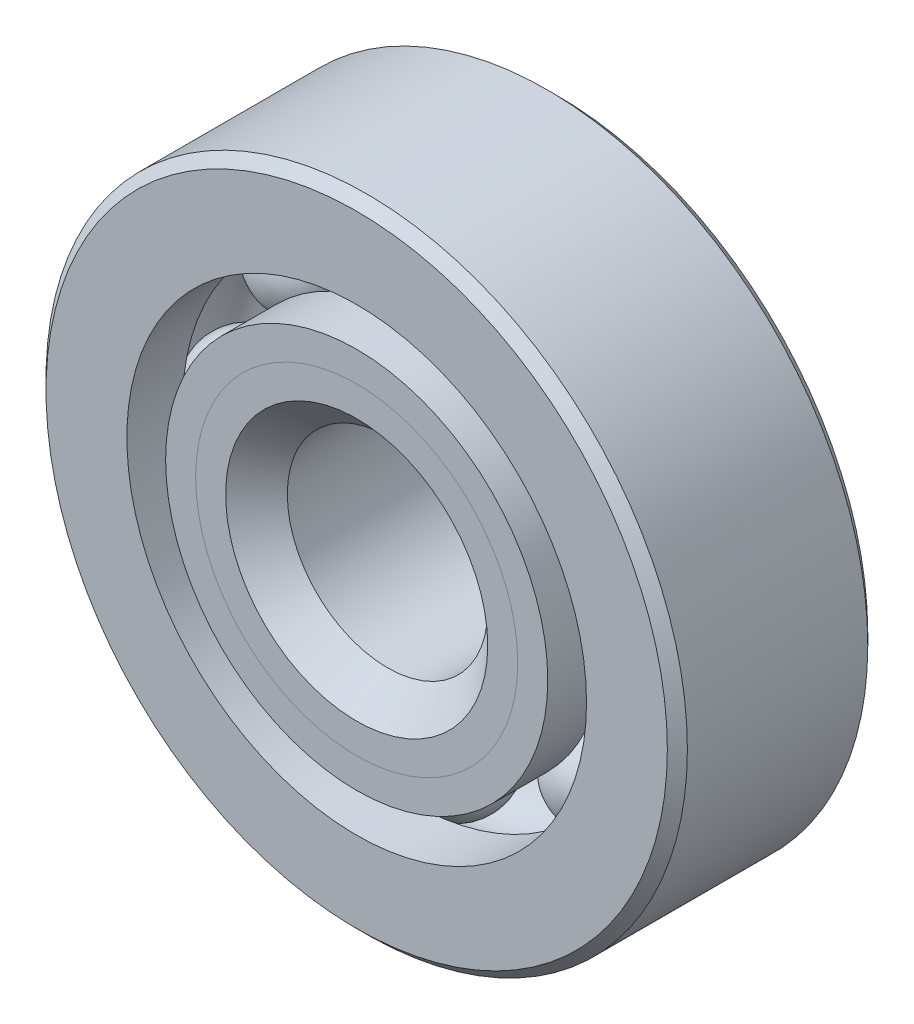
ISO-10303-21;
HEADER;
FILE_DESCRIPTION(('STEP AP214'),'2;1');
FILE_NAME('part.step','',(''),(''),'','','');
FILE_SCHEMA(('AUTOMOTIVE_DESIGN { 1 0 10303 214 1 1 1 1 }'));
ENDSEC;
DATA;
#1=APPLICATION_CONTEXT('core data for automotive mechanical design processes');
#2=APPLICATION_PROTOCOL_DEFINITION('international standard','automotive_design',2000,#1);
#3=PRODUCT_CONTEXT('',#1,'mechanical');
#4=PRODUCT('Part','Part','',(#3));
#5=PRODUCT_RELATED_PRODUCT_CATEGORY('part','',(#4));
#6=PRODUCT_DEFINITION_FORMATION('','',#4);
#7=PRODUCT_DEFINITION_CONTEXT('part definition',#1,'design');
#8=PRODUCT_DEFINITION('design','',#6,#7);
#9=PRODUCT_DEFINITION_SHAPE('','',#8);
#10=(LENGTH_UNIT() NAMED_UNIT(*) SI_UNIT(.MILLI.,.METRE.));
#11=(NAMED_UNIT(*) PLANE_ANGLE_UNIT() SI_UNIT($,.RADIAN.));
#12=(NAMED_UNIT(*) SI_UNIT($,.STERADIAN.) SOLID_ANGLE_UNIT());
#13=UNCERTAINTY_MEASURE_WITH_UNIT(LENGTH_MEASURE(1.E-05),#10,'distance_accuracy_value','');
#14=(GEOMETRIC_REPRESENTATION_CONTEXT(3) GLOBAL_UNCERTAINTY_ASSIGNED_CONTEXT((#13)) GLOBAL_UNIT_ASSIGNED_CONTEXT((#10,
#11,#12)) REPRESENTATION_CONTEXT('',''));
#15=CARTESIAN_POINT('',(0.,0.,0.));
#16=DIRECTION('',(0.,0.,1.));
#17=DIRECTION('',(1.,0.,0.));
#18=AXIS2_PLACEMENT_3D('',#15,#16,#17);
#19=CARTESIAN_POINT('',(-3.71231060122933,3.71231060122942,0.));
#20=DIRECTION('',(0.,0.,1.));
#21=DIRECTION('',(-0.707106781186539,0.707106781186556,0.));
#22=AXIS2_PLACEMENT_3D('',#19,#20,#21);
#23=SPHERICAL_SURFACE('',#22,1.21175743903915);
#24=CARTESIAN_POINT('',(-3.71231060122933,3.71231060122942,1.21175743903915));
#25=VERTEX_POINT('',#24);
#26=VERTEX_LOOP('',#25);
#27=FACE_BOUND('',#26,.T.);
#28=ADVANCED_FACE('F37',(#27),#23,.T.);
#29=CLOSED_SHELL('',(#28));
#30=MANIFOLD_SOLID_BREP('B2',#29);
#31=CARTESIAN_POINT('',(-5.25,0.,0.));
#32=DIRECTION('',(0.,0.,1.));
#33=DIRECTION('',(-1.,0.,0.));
#34=AXIS2_PLACEMENT_3D('',#31,#32,#33);
#35=SPHERICAL_SURFACE('',#34,1.21175743903915);
#36=CARTESIAN_POINT('',(-5.25,0.,1.21175743903915));
#37=VERTEX_POINT('',#36);
#38=VERTEX_LOOP('',#37);
#39=FACE_BOUND('',#38,.T.);
#40=ADVANCED_FACE('F68',(#39),#35,.T.);
#41=CLOSED_SHELL('',(#40));
#42=MANIFOLD_SOLID_BREP('B6',#41);
#43=CARTESIAN_POINT('',(-3.71231060122941,-3.71231060122934,0.));
#44=DIRECTION('',(0.,0.,1.));
#45=DIRECTION('',(-0.707106781186554,-0.707106781186541,0.));
#46=AXIS2_PLACEMENT_3D('',#43,#44,#45);
#47=SPHERICAL_SURFACE('',#46,1.21175743903915);
#48=CARTESIAN_POINT('',(-3.71231060122941,-3.71231060122934,1.21175743903915));
#49=VERTEX_POINT('',#48);
#50=VERTEX_LOOP('',#49);
#51=FACE_BOUND('',#50,.T.);
#52=ADVANCED_FACE('F99',(#51),#47,.T.);
#53=CLOSED_SHELL('',(#52));
#54=MANIFOLD_SOLID_BREP('B33',#53);
#55=CARTESIAN_POINT('',(0.,-5.25,0.));
#56=DIRECTION('',(0.,0.,1.));
#57=DIRECTION('',(0.,-1.,0.));
#58=AXIS2_PLACEMENT_3D('',#55,#56,#57);
#59=SPHERICAL_SURFACE('',#58,1.21175743903915);
#60=CARTESIAN_POINT('',(0.,-5.25,1.21175743903915));
#61=VERTEX_POINT('',#60);
#62=VERTEX_LOOP('',#61);
#63=FACE_BOUND('',#62,.T.);
#64=ADVANCED_FACE('F130',(#63),#59,.T.);
#65=CLOSED_SHELL('',(#64));
#66=MANIFOLD_SOLID_BREP('B64',#65);
#67=CARTESIAN_POINT('',(3.71231060122936,-3.71231060122939,0.));
#68=DIRECTION('',(0.,0.,1.));
#69=DIRECTION('',(0.707106781186544,-0.707106781186551,0.));
#70=AXIS2_PLACEMENT_3D('',#67,#68,#69);
#71=SPHERICAL_SURFACE('',#70,1.21175743903915);
#72=CARTESIAN_POINT('',(3.71231060122936,-3.71231060122939,1.21175743903915));
#73=VERTEX_POINT('',#72);
#74=VERTEX_LOOP('',#73);
#75=FACE_BOUND('',#74,.T.);
#76=ADVANCED_FACE('F161',(#75),#71,.T.);
#77=CLOSED_SHELL('',(#76));
#78=MANIFOLD_SOLID_BREP('B95',#77);
#79=CARTESIAN_POINT('',(5.25,0.,0.));
#80=DIRECTION('',(0.,0.,1.));
#81=DIRECTION('',(1.,0.,0.));
#82=AXIS2_PLACEMENT_3D('',#79,#80,#81);
#83=SPHERICAL_SURFACE('',#82,1.21175743903915);
#84=CARTESIAN_POINT('',(5.25,0.,1.21175743903915));
#85=VERTEX_POINT('',#84);
#86=VERTEX_LOOP('',#85);
#87=FACE_BOUND('',#86,.T.);
#88=ADVANCED_FACE('F192',(#87),#83,.T.);
#89=CLOSED_SHELL('',(#88));
#90=MANIFOLD_SOLID_BREP('B126',#89);
#91=CARTESIAN_POINT('',(3.71231060122938,3.71231060122937,0.));
#92=DIRECTION('',(0.,0.,1.));
#93=DIRECTION('',(0.707106781186549,0.707106781186546,0.));
#94=AXIS2_PLACEMENT_3D('',#91,#92,#93);
#95=SPHERICAL_SURFACE('',#94,1.21175743903915);
#96=CARTESIAN_POINT('',(3.71231060122938,3.71231060122937,1.21175743903915));
#97=VERTEX_POINT('',#96);
#98=VERTEX_LOOP('',#97);
#99=FACE_BOUND('',#98,.T.);
#100=ADVANCED_FACE('F223',(#99),#95,.T.);
#101=CLOSED_SHELL('',(#100));
#102=MANIFOLD_SOLID_BREP('B157',#101);
#103=CARTESIAN_POINT('',(0.,5.25,0.));
#104=DIRECTION('',(0.,0.,1.));
#105=DIRECTION('',(0.,1.,0.));
#106=AXIS2_PLACEMENT_3D('',#103,#104,#105);
#107=SPHERICAL_SURFACE('',#106,1.21175743903915);
#108=CARTESIAN_POINT('',(0.,5.25,1.21175743903915));
#109=VERTEX_POINT('',#108);
#110=VERTEX_LOOP('',#109);
#111=FACE_BOUND('',#110,.T.);
#112=ADVANCED_FACE('F256',(#111),#107,.T.);
#113=CLOSED_SHELL('',(#112));
#114=MANIFOLD_SOLID_BREP('B188',#113);
#115=CARTESIAN_POINT('',(0.,4.01780239848197,2.5));
#116=DIRECTION('',(0.,0.,-1.));
#117=DIRECTION('',(-1.,0.,0.));
#118=AXIS2_PLACEMENT_3D('',#115,#116,#117);
#119=PLANE('',#118);
#120=CARTESIAN_POINT('',(0.,0.,2.5));
#121=DIRECTION('',(0.,0.,1.));
#122=DIRECTION('',(1.,0.,0.));
#123=AXIS2_PLACEMENT_3D('',#120,#121,#122);
#124=CIRCLE('',#123,3.26912128048043);
#125=CARTESIAN_POINT('',(3.26912128048043,0.,2.5));
#126=VERTEX_POINT('',#125);
#127=EDGE_CURVE('E310',#126,#126,#124,.T.);
#128=ORIENTED_EDGE('',*,*,#127,.F.);
#129=EDGE_LOOP('',(#128));
#130=FACE_BOUND('',#129,.T.);
#131=CARTESIAN_POINT('',(0.,0.,2.5));
#132=DIRECTION('',(0.,0.,1.));
#133=DIRECTION('',(1.,0.,0.));
#134=AXIS2_PLACEMENT_3D('',#131,#132,#133);
#135=CIRCLE('',#134,4.01780239848197);
#136=CARTESIAN_POINT('',(4.01780239848197,0.,2.5));
#137=VERTEX_POINT('',#136);
#138=EDGE_CURVE('E255',#137,#137,#135,.T.);
#139=ORIENTED_EDGE('',*,*,#138,.T.);
#140=EDGE_LOOP('',(#139));
#141=FACE_BOUND('',#140,.T.);
#142=ADVANCED_FACE('F276',(#130,#141),#119,.F.);
#143=CARTESIAN_POINT('',(0.,0.,1.75131888199845));
#144=DIRECTION('',(0.,0.,1.));
#145=DIRECTION('',(1.,0.,0.));
#146=AXIS2_PLACEMENT_3D('',#143,#144,#145);
#147=CONICAL_SURFACE('',#146,3.26912128048043,0.78539816339745);
#148=ORIENTED_EDGE('',*,*,#138,.F.);
#149=EDGE_LOOP('',(#148));
#150=FACE_BOUND('',#149,.T.);
#151=CARTESIAN_POINT('',(0.,0.,1.75131888199845));
#152=DIRECTION('',(0.,0.,1.));
#153=DIRECTION('',(1.,0.,0.));
#154=AXIS2_PLACEMENT_3D('',#151,#152,#153);
#155=CIRCLE('',#154,3.26912128048043);
#156=CARTESIAN_POINT('',(3.26912128048043,0.,1.75131888199845));
#157=VERTEX_POINT('',#156);
#158=EDGE_CURVE('E282',#157,#157,#155,.T.);
#159=ORIENTED_EDGE('',*,*,#158,.T.);
#160=EDGE_LOOP('',(#159));
#161=FACE_BOUND('',#160,.T.);
#162=ADVANCED_FACE('F317',(#150,#161),#147,.T.);
#163=CARTESIAN_POINT('',(0.,0.,2.5));
#164=DIRECTION('',(0.,0.,1.));
#165=DIRECTION('',(1.,0.,0.));
#166=AXIS2_PLACEMENT_3D('',#163,#164,#165);
#167=CYLINDRICAL_SURFACE('',#166,3.26912128048043);
#168=ORIENTED_EDGE('',*,*,#158,.F.);
#169=EDGE_LOOP('',(#168));
#170=FACE_BOUND('',#169,.T.);
#171=CARTESIAN_POINT('',(0.,0.,0.));
#172=DIRECTION('',(0.,0.,1.));
#173=DIRECTION('',(1.,0.,0.));
#174=AXIS2_PLACEMENT_3D('',#171,#172,#173);
#175=CIRCLE('',#174,3.26912128048043);
#176=CARTESIAN_POINT('',(3.26912128048043,0.,0.));
#177=VERTEX_POINT('',#176);
#178=EDGE_CURVE('E286',#177,#177,#175,.T.);
#179=ORIENTED_EDGE('',*,*,#178,.T.);
#180=EDGE_LOOP('',(#179));
#181=FACE_BOUND('',#180,.T.);
#182=ADVANCED_FACE('F321',(#170,#181),#167,.T.);
#183=CARTESIAN_POINT('',(0.,3.26912128048043,0.));
#184=DIRECTION('',(0.,0.,-1.));
#185=DIRECTION('',(-1.,0.,0.));
#186=AXIS2_PLACEMENT_3D('',#183,#184,#185);
#187=PLANE('',#186);
#188=ORIENTED_EDGE('',*,*,#178,.F.);
#189=EDGE_LOOP('',(#188));
#190=FACE_BOUND('',#189,.T.);
#191=CARTESIAN_POINT('',(0.,0.,0.));
#192=DIRECTION('',(0.,0.,1.));
#193=DIRECTION('',(1.,0.,0.));
#194=AXIS2_PLACEMENT_3D('',#191,#192,#193);
#195=CIRCLE('',#194,4.03824256096085);
#196=CARTESIAN_POINT('',(4.03824256096085,0.,0.));
#197=VERTEX_POINT('',#196);
#198=EDGE_CURVE('E290',#197,#197,#195,.T.);
#199=ORIENTED_EDGE('',*,*,#198,.T.);
#200=EDGE_LOOP('',(#199));
#201=FACE_BOUND('',#200,.T.);
#202=ADVANCED_FACE('F326',(#190,#201),#187,.F.);
#203=CARTESIAN_POINT('',(0.,0.,0.));
#204=DIRECTION('',(0.,0.,1.));
#205=DIRECTION('',(1.,0.,0.));
#206=AXIS2_PLACEMENT_3D('',#203,#204,#205);
#207=TOROIDAL_SURFACE('',#206,5.25,1.21175743903915);
#208=ORIENTED_EDGE('',*,*,#198,.F.);
#209=EDGE_LOOP('',(#208));
#210=FACE_BOUND('',#209,.T.);
#211=CARTESIAN_POINT('',(0.,0.,-1.11111111111111));
#212=DIRECTION('',(0.,0.,1.));
#213=DIRECTION('',(1.,0.,0.));
#214=AXIS2_PLACEMENT_3D('',#211,#212,#213);
#215=CIRCLE('',#214,4.76648351648352);
#216=CARTESIAN_POINT('',(4.76648351648352,0.,-1.11111111111111));
#217=VERTEX_POINT('',#216);
#218=EDGE_CURVE('E295',#217,#217,#215,.T.);
#219=ORIENTED_EDGE('',*,*,#218,.T.);
#220=EDGE_LOOP('',(#219));
#221=FACE_BOUND('',#220,.T.);
#222=ADVANCED_FACE('F332',(#210,#221),#207,.F.);
#223=CARTESIAN_POINT('',(0.,0.,2.5));
#224=DIRECTION('',(0.,0.,1.));
#225=DIRECTION('',(1.,0.,0.));
#226=AXIS2_PLACEMENT_3D('',#223,#224,#225);
#227=CYLINDRICAL_SURFACE('',#226,4.76648351648352);
#228=ORIENTED_EDGE('',*,*,#218,.F.);
#229=EDGE_LOOP('',(#228));
#230=FACE_BOUND('',#229,.T.);
#231=CARTESIAN_POINT('',(0.,0.,-2.5));
#232=DIRECTION('',(0.,0.,1.));
#233=DIRECTION('',(1.,0.,0.));
#234=AXIS2_PLACEMENT_3D('',#231,#232,#233);
#235=CIRCLE('',#234,4.76648351648352);
#236=CARTESIAN_POINT('',(4.76648351648352,0.,-2.5));
#237=VERTEX_POINT('',#236);
#238=EDGE_CURVE('E298',#237,#237,#235,.T.);
#239=ORIENTED_EDGE('',*,*,#238,.T.);
#240=EDGE_LOOP('',(#239));
#241=FACE_BOUND('',#240,.T.);
#242=ADVANCED_FACE('F336',(#230,#241),#227,.T.);
#243=CARTESIAN_POINT('',(0.,2.75,-2.5));
#244=DIRECTION('',(0.,0.,1.));
#245=DIRECTION('',(1.,0.,0.));
#246=AXIS2_PLACEMENT_3D('',#243,#244,#245);
#247=PLANE('',#246);
#248=ORIENTED_EDGE('',*,*,#238,.F.);
#249=EDGE_LOOP('',(#248));
#250=FACE_BOUND('',#249,.T.);
#251=CARTESIAN_POINT('',(0.,0.,-2.5));
#252=DIRECTION('',(0.,0.,1.));
#253=DIRECTION('',(1.,0.,0.));
#254=AXIS2_PLACEMENT_3D('',#251,#252,#253);
#255=CIRCLE('',#254,2.75);
#256=CARTESIAN_POINT('',(2.75,0.,-2.5));
#257=VERTEX_POINT('',#256);
#258=EDGE_CURVE('E301',#257,#257,#255,.T.);
#259=ORIENTED_EDGE('',*,*,#258,.T.);
#260=EDGE_LOOP('',(#259));
#261=FACE_BOUND('',#260,.T.);
#262=ADVANCED_FACE('F340',(#250,#261),#247,.F.);
#263=CARTESIAN_POINT('',(0.,0.,-2.25));
#264=DIRECTION('',(0.,0.,-1.));
#265=DIRECTION('',(-1.,0.,0.));
#266=AXIS2_PLACEMENT_3D('',#263,#264,#265);
#267=CONICAL_SURFACE('',#266,2.5,0.785398163397447);
#268=ORIENTED_EDGE('',*,*,#258,.F.);
#269=EDGE_LOOP('',(#268));
#270=FACE_BOUND('',#269,.T.);
#271=CARTESIAN_POINT('',(0.,0.,-2.25));
#272=DIRECTION('',(0.,0.,1.));
#273=DIRECTION('',(1.,0.,0.));
#274=AXIS2_PLACEMENT_3D('',#271,#272,#273);
#275=CIRCLE('',#274,2.5);
#276=CARTESIAN_POINT('',(2.5,0.,-2.25));
#277=VERTEX_POINT('',#276);
#278=EDGE_CURVE('E304',#277,#277,#275,.T.);
#279=ORIENTED_EDGE('',*,*,#278,.T.);
#280=EDGE_LOOP('',(#279));
#281=FACE_BOUND('',#280,.T.);
#282=ADVANCED_FACE('F344',(#270,#281),#267,.F.);
#283=CARTESIAN_POINT('',(0.,0.,2.5));
#284=DIRECTION('',(0.,0.,1.));
#285=DIRECTION('',(1.,0.,0.));
#286=AXIS2_PLACEMENT_3D('',#283,#284,#285);
#287=CYLINDRICAL_SURFACE('',#286,2.5);
#288=ORIENTED_EDGE('',*,*,#278,.F.);
#289=EDGE_LOOP('',(#288));
#290=FACE_BOUND('',#289,.T.);
#291=CARTESIAN_POINT('',(0.,0.,1.73087871951957));
#292=DIRECTION('',(0.,0.,1.));
#293=DIRECTION('',(1.,0.,0.));
#294=AXIS2_PLACEMENT_3D('',#291,#292,#293);
#295=CIRCLE('',#294,2.5);
#296=CARTESIAN_POINT('',(2.5,0.,1.73087871951957));
#297=VERTEX_POINT('',#296);
#298=EDGE_CURVE('E307',#297,#297,#295,.T.);
#299=ORIENTED_EDGE('',*,*,#298,.T.);
#300=EDGE_LOOP('',(#299));
#301=FACE_BOUND('',#300,.T.);
#302=ADVANCED_FACE('F348',(#290,#301),#287,.F.);
#303=CARTESIAN_POINT('',(0.,0.,2.5));
#304=DIRECTION('',(0.,0.,1.));
#305=DIRECTION('',(1.,0.,0.));
#306=AXIS2_PLACEMENT_3D('',#303,#304,#305);
#307=CONICAL_SURFACE('',#306,3.26912128048043,0.78539816339745);
#308=ORIENTED_EDGE('',*,*,#298,.F.);
#309=EDGE_LOOP('',(#308));
#310=FACE_BOUND('',#309,.T.);
#311=ORIENTED_EDGE('',*,*,#127,.T.);
#312=EDGE_LOOP('',(#311));
#313=FACE_BOUND('',#312,.T.);
#314=ADVANCED_FACE('F314',(#310,#313),#307,.F.);
#315=CLOSED_SHELL('',(#142,#162,#182,#202,#222,#242,#262,#282,#302,#314));
#316=MANIFOLD_SOLID_BREP('B219',#315);
#317=CARTESIAN_POINT('',(0.,4.76648351648352,2.5));
#318=DIRECTION('',(0.,0.,-1.));
#319=DIRECTION('',(-1.,0.,0.));
#320=AXIS2_PLACEMENT_3D('',#317,#318,#319);
#321=PLANE('',#320);
#322=CARTESIAN_POINT('',(0.,0.,2.5));
#323=DIRECTION('',(0.,0.,1.));
#324=DIRECTION('',(1.,0.,0.));
#325=AXIS2_PLACEMENT_3D('',#322,#323,#324);
#326=CIRCLE('',#325,4.01780239848197);
#327=CARTESIAN_POINT('',(4.01780239848197,0.,2.5));
#328=VERTEX_POINT('',#327);
#329=EDGE_CURVE('E275',#328,#328,#326,.T.);
#330=ORIENTED_EDGE('',*,*,#329,.F.);
#331=EDGE_LOOP('',(#330));
#332=FACE_BOUND('',#331,.T.);
#333=CARTESIAN_POINT('',(0.,0.,2.5));
#334=DIRECTION('',(0.,0.,1.));
#335=DIRECTION('',(1.,0.,0.));
#336=AXIS2_PLACEMENT_3D('',#333,#334,#335);
#337=CIRCLE('',#336,4.76648351648352);
#338=CARTESIAN_POINT('',(4.76648351648352,0.,2.5));
#339=VERTEX_POINT('',#338);
#340=EDGE_CURVE('E456',#339,#339,#337,.T.);
#341=ORIENTED_EDGE('',*,*,#340,.T.);
#342=EDGE_LOOP('',(#341));
#343=FACE_BOUND('',#342,.T.);
#344=ADVANCED_FACE('F434',(#332,#343),#321,.F.);
#345=CARTESIAN_POINT('',(0.,0.,2.5));
#346=DIRECTION('',(0.,0.,1.));
#347=DIRECTION('',(1.,0.,0.));
#348=AXIS2_PLACEMENT_3D('',#345,#346,#347);
#349=CONICAL_SURFACE('',#348,4.01780239848197,0.78539816339745);
#350=CARTESIAN_POINT('',(0.,0.,1.75131888199845));
#351=DIRECTION('',(0.,0.,1.));
#352=DIRECTION('',(1.,0.,0.));
#353=AXIS2_PLACEMENT_3D('',#350,#351,#352);
#354=CIRCLE('',#353,3.26912128048043);
#355=CARTESIAN_POINT('',(3.26912128048043,0.,1.75131888199845));
#356=VERTEX_POINT('',#355);
#357=EDGE_CURVE('E440',#356,#356,#354,.T.);
#358=ORIENTED_EDGE('',*,*,#357,.F.);
#359=EDGE_LOOP('',(#358));
#360=FACE_BOUND('',#359,.T.);
#361=ORIENTED_EDGE('',*,*,#329,.T.);
#362=EDGE_LOOP('',(#361));
#363=FACE_BOUND('',#362,.T.);
#364=ADVANCED_FACE('F481',(#360,#363),#349,.F.);
#365=CARTESIAN_POINT('',(0.,0.,2.5));
#366=DIRECTION('',(0.,0.,1.));
#367=DIRECTION('',(1.,0.,0.));
#368=AXIS2_PLACEMENT_3D('',#365,#366,#367);
#369=CYLINDRICAL_SURFACE('',#368,3.26912128048043);
#370=CARTESIAN_POINT('',(0.,0.,0.));
#371=DIRECTION('',(0.,0.,1.));
#372=DIRECTION('',(1.,0.,0.));
#373=AXIS2_PLACEMENT_3D('',#370,#371,#372);
#374=CIRCLE('',#373,3.26912128048043);
#375=CARTESIAN_POINT('',(3.26912128048043,0.,0.));
#376=VERTEX_POINT('',#375);
#377=EDGE_CURVE('E444',#376,#376,#374,.T.);
#378=ORIENTED_EDGE('',*,*,#377,.F.);
#379=EDGE_LOOP('',(#378));
#380=FACE_BOUND('',#379,.T.);
#381=ORIENTED_EDGE('',*,*,#357,.T.);
#382=EDGE_LOOP('',(#381));
#383=FACE_BOUND('',#382,.T.);
#384=ADVANCED_FACE('F476',(#380,#383),#369,.F.);
#385=CARTESIAN_POINT('',(0.,3.26912128048043,0.));
#386=DIRECTION('',(0.,0.,1.));
#387=DIRECTION('',(1.,0.,0.));
#388=AXIS2_PLACEMENT_3D('',#385,#386,#387);
#389=PLANE('',#388);
#390=CARTESIAN_POINT('',(0.,0.,0.));
#391=DIRECTION('',(0.,0.,1.));
#392=DIRECTION('',(1.,0.,0.));
#393=AXIS2_PLACEMENT_3D('',#390,#391,#392);
#394=CIRCLE('',#393,4.03824256096085);
#395=CARTESIAN_POINT('',(4.03824256096085,0.,0.));
#396=VERTEX_POINT('',#395);
#397=EDGE_CURVE('E448',#396,#396,#394,.T.);
#398=ORIENTED_EDGE('',*,*,#397,.F.);
#399=EDGE_LOOP('',(#398));
#400=FACE_BOUND('',#399,.T.);
#401=ORIENTED_EDGE('',*,*,#377,.T.);
#402=EDGE_LOOP('',(#401));
#403=FACE_BOUND('',#402,.T.);
#404=ADVANCED_FACE('F470',(#400,#403),#389,.F.);
#405=CARTESIAN_POINT('',(0.,0.,0.));
#406=DIRECTION('',(0.,0.,1.));
#407=DIRECTION('',(1.,0.,0.));
#408=AXIS2_PLACEMENT_3D('',#405,#406,#407);
#409=TOROIDAL_SURFACE('',#408,5.25,1.21175743903915);
#410=CARTESIAN_POINT('',(0.,0.,1.11111111111111));
#411=DIRECTION('',(0.,0.,1.));
#412=DIRECTION('',(1.,0.,0.));
#413=AXIS2_PLACEMENT_3D('',#410,#411,#412);
#414=CIRCLE('',#413,4.76648351648352);
#415=CARTESIAN_POINT('',(4.76648351648352,0.,1.11111111111111));
#416=VERTEX_POINT('',#415);
#417=EDGE_CURVE('E453',#416,#416,#414,.T.);
#418=ORIENTED_EDGE('',*,*,#417,.F.);
#419=EDGE_LOOP('',(#418));
#420=FACE_BOUND('',#419,.T.);
#421=ORIENTED_EDGE('',*,*,#397,.T.);
#422=EDGE_LOOP('',(#421));
#423=FACE_BOUND('',#422,.T.);
#424=ADVANCED_FACE('F464',(#420,#423),#409,.F.);
#425=CARTESIAN_POINT('',(0.,0.,2.5));
#426=DIRECTION('',(0.,0.,1.));
#427=DIRECTION('',(1.,0.,0.));
#428=AXIS2_PLACEMENT_3D('',#425,#426,#427);
#429=CYLINDRICAL_SURFACE('',#428,4.76648351648352);
#430=ORIENTED_EDGE('',*,*,#340,.F.);
#431=EDGE_LOOP('',(#430));
#432=FACE_BOUND('',#431,.T.);
#433=ORIENTED_EDGE('',*,*,#417,.T.);
#434=EDGE_LOOP('',(#433));
#435=FACE_BOUND('',#434,.T.);
#436=ADVANCED_FACE('F461',(#432,#435),#429,.T.);
#437=CLOSED_SHELL('',(#344,#364,#384,#404,#424,#436));
#438=MANIFOLD_SOLID_BREP('B250',#437);
#439=CARTESIAN_POINT('',(0.,0.,2.25));
#440=DIRECTION('',(0.,0.,-1.));
#441=DIRECTION('',(-1.,0.,0.));
#442=AXIS2_PLACEMENT_3D('',#439,#440,#441);
#443=CONICAL_SURFACE('',#442,8.,0.785398163397446);
#444=CARTESIAN_POINT('',(0.,0.,2.5));
#445=DIRECTION('',(0.,0.,1.));
#446=DIRECTION('',(1.,0.,0.));
#447=AXIS2_PLACEMENT_3D('',#444,#445,#446);
#448=CIRCLE('',#447,7.75);
#449=CARTESIAN_POINT('',(7.75,0.,2.5));
#450=VERTEX_POINT('',#449);
#451=EDGE_CURVE('E553',#450,#450,#448,.T.);
#452=ORIENTED_EDGE('',*,*,#451,.F.);
#453=EDGE_LOOP('',(#452));
#454=FACE_BOUND('',#453,.T.);
#455=CARTESIAN_POINT('',(0.,0.,2.25));
#456=DIRECTION('',(0.,0.,1.));
#457=DIRECTION('',(1.,0.,0.));
#458=AXIS2_PLACEMENT_3D('',#455,#456,#457);
#459=CIRCLE('',#458,8.);
#460=CARTESIAN_POINT('',(8.,0.,2.25));
#461=VERTEX_POINT('',#460);
#462=EDGE_CURVE('E433',#461,#461,#459,.T.);
#463=ORIENTED_EDGE('',*,*,#462,.T.);
#464=EDGE_LOOP('',(#463));
#465=FACE_BOUND('',#464,.T.);
#466=ADVANCED_FACE('F525',(#454,#465),#443,.T.);
#467=CARTESIAN_POINT('',(0.,0.,2.5));
#468=DIRECTION('',(0.,0.,1.));
#469=DIRECTION('',(1.,0.,0.));
#470=AXIS2_PLACEMENT_3D('',#467,#468,#469);
#471=CYLINDRICAL_SURFACE('',#470,8.);
#472=ORIENTED_EDGE('',*,*,#462,.F.);
#473=EDGE_LOOP('',(#472));
#474=FACE_BOUND('',#473,.T.);
#475=CARTESIAN_POINT('',(0.,0.,-2.25));
#476=DIRECTION('',(0.,0.,1.));
#477=DIRECTION('',(1.,0.,0.));
#478=AXIS2_PLACEMENT_3D('',#475,#476,#477);
#479=CIRCLE('',#478,8.);
#480=CARTESIAN_POINT('',(8.,0.,-2.25));
#481=VERTEX_POINT('',#480);
#482=EDGE_CURVE('E531',#481,#481,#479,.T.);
#483=ORIENTED_EDGE('',*,*,#482,.T.);
#484=EDGE_LOOP('',(#483));
#485=FACE_BOUND('',#484,.T.);
#486=ADVANCED_FACE('F560',(#474,#485),#471,.T.);
#487=CARTESIAN_POINT('',(0.,0.,-2.5));
#488=DIRECTION('',(0.,0.,1.));
#489=DIRECTION('',(1.,0.,0.));
#490=AXIS2_PLACEMENT_3D('',#487,#488,#489);
#491=CONICAL_SURFACE('',#490,7.75,0.785398163397445);
#492=ORIENTED_EDGE('',*,*,#482,.F.);
#493=EDGE_LOOP('',(#492));
#494=FACE_BOUND('',#493,.T.);
#495=CARTESIAN_POINT('',(0.,0.,-2.5));
#496=DIRECTION('',(0.,0.,1.));
#497=DIRECTION('',(1.,0.,0.));
#498=AXIS2_PLACEMENT_3D('',#495,#496,#497);
#499=CIRCLE('',#498,7.75);
#500=CARTESIAN_POINT('',(7.75,0.,-2.5));
#501=VERTEX_POINT('',#500);
#502=EDGE_CURVE('E535',#501,#501,#499,.T.);
#503=ORIENTED_EDGE('',*,*,#502,.T.);
#504=EDGE_LOOP('',(#503));
#505=FACE_BOUND('',#504,.T.);
#506=ADVANCED_FACE('F564',(#494,#505),#491,.T.);
#507=CARTESIAN_POINT('',(0.,7.75,-2.5));
#508=DIRECTION('',(0.,0.,1.));
#509=DIRECTION('',(1.,0.,0.));
#510=AXIS2_PLACEMENT_3D('',#507,#508,#509);
#511=PLANE('',#510);
#512=ORIENTED_EDGE('',*,*,#502,.F.);
#513=EDGE_LOOP('',(#512));
#514=FACE_BOUND('',#513,.T.);
#515=CARTESIAN_POINT('',(0.,0.,-2.5));
#516=DIRECTION('',(0.,0.,1.));
#517=DIRECTION('',(1.,0.,0.));
#518=AXIS2_PLACEMENT_3D('',#515,#516,#517);
#519=CIRCLE('',#518,5.73351648351648);
#520=CARTESIAN_POINT('',(5.73351648351648,0.,-2.5));
#521=VERTEX_POINT('',#520);
#522=EDGE_CURVE('E539',#521,#521,#519,.T.);
#523=ORIENTED_EDGE('',*,*,#522,.T.);
#524=EDGE_LOOP('',(#523));
#525=FACE_BOUND('',#524,.T.);
#526=ADVANCED_FACE('F569',(#514,#525),#511,.F.);
#527=CARTESIAN_POINT('',(0.,0.,2.5));
#528=DIRECTION('',(0.,0.,1.));
#529=DIRECTION('',(1.,0.,0.));
#530=AXIS2_PLACEMENT_3D('',#527,#528,#529);
#531=CYLINDRICAL_SURFACE('',#530,5.73351648351648);
#532=ORIENTED_EDGE('',*,*,#522,.F.);
#533=EDGE_LOOP('',(#532));
#534=FACE_BOUND('',#533,.T.);
#535=CARTESIAN_POINT('',(0.,0.,-1.11111111111111));
#536=DIRECTION('',(0.,0.,1.));
#537=DIRECTION('',(1.,0.,0.));
#538=AXIS2_PLACEMENT_3D('',#535,#536,#537);
#539=CIRCLE('',#538,5.73351648351648);
#540=CARTESIAN_POINT('',(5.73351648351648,0.,-1.11111111111111));
#541=VERTEX_POINT('',#540);
#542=EDGE_CURVE('E544',#541,#541,#539,.T.);
#543=ORIENTED_EDGE('',*,*,#542,.T.);
#544=EDGE_LOOP('',(#543));
#545=FACE_BOUND('',#544,.T.);
#546=ADVANCED_FACE('F575',(#534,#545),#531,.F.);
#547=CARTESIAN_POINT('',(0.,0.,0.));
#548=DIRECTION('',(0.,0.,1.));
#549=DIRECTION('',(1.,0.,0.));
#550=AXIS2_PLACEMENT_3D('',#547,#548,#549);
#551=TOROIDAL_SURFACE('',#550,5.25,1.21175743903915);
#552=ORIENTED_EDGE('',*,*,#542,.F.);
#553=EDGE_LOOP('',(#552));
#554=FACE_BOUND('',#553,.T.);
#555=CARTESIAN_POINT('',(0.,0.,1.11111111111111));
#556=DIRECTION('',(0.,0.,1.));
#557=DIRECTION('',(1.,0.,0.));
#558=AXIS2_PLACEMENT_3D('',#555,#556,#557);
#559=CIRCLE('',#558,5.73351648351648);
#560=CARTESIAN_POINT('',(5.73351648351648,0.,1.11111111111111));
#561=VERTEX_POINT('',#560);
#562=EDGE_CURVE('E547',#561,#561,#559,.T.);
#563=ORIENTED_EDGE('',*,*,#562,.T.);
#564=EDGE_LOOP('',(#563));
#565=FACE_BOUND('',#564,.T.);
#566=ADVANCED_FACE('F579',(#554,#565),#551,.F.);
#567=CARTESIAN_POINT('',(0.,0.,2.5));
#568=DIRECTION('',(0.,0.,1.));
#569=DIRECTION('',(1.,0.,0.));
#570=AXIS2_PLACEMENT_3D('',#567,#568,#569);
#571=CYLINDRICAL_SURFACE('',#570,5.73351648351648);
#572=ORIENTED_EDGE('',*,*,#562,.F.);
#573=EDGE_LOOP('',(#572));
#574=FACE_BOUND('',#573,.T.);
#575=CARTESIAN_POINT('',(0.,0.,2.5));
#576=DIRECTION('',(0.,0.,1.));
#577=DIRECTION('',(1.,0.,0.));
#578=AXIS2_PLACEMENT_3D('',#575,#576,#577);
#579=CIRCLE('',#578,5.73351648351648);
#580=CARTESIAN_POINT('',(5.73351648351648,0.,2.5));
#581=VERTEX_POINT('',#580);
#582=EDGE_CURVE('E550',#581,#581,#579,.T.);
#583=ORIENTED_EDGE('',*,*,#582,.T.);
#584=EDGE_LOOP('',(#583));
#585=FACE_BOUND('',#584,.T.);
#586=ADVANCED_FACE('F583',(#574,#585),#571,.F.);
#587=CARTESIAN_POINT('',(0.,7.75,2.5));
#588=DIRECTION('',(0.,0.,-1.));
#589=DIRECTION('',(-1.,0.,0.));
#590=AXIS2_PLACEMENT_3D('',#587,#588,#589);
#591=PLANE('',#590);
#592=ORIENTED_EDGE('',*,*,#582,.F.);
#593=EDGE_LOOP('',(#592));
#594=FACE_BOUND('',#593,.T.);
#595=ORIENTED_EDGE('',*,*,#451,.T.);
#596=EDGE_LOOP('',(#595));
#597=FACE_BOUND('',#596,.T.);
#598=ADVANCED_FACE('F557',(#594,#597),#591,.F.);
#599=CLOSED_SHELL('',(#466,#486,#506,#526,#546,#566,#586,#598));
#600=MANIFOLD_SOLID_BREP('B270',#599);
#601=ADVANCED_BREP_SHAPE_REPRESENTATION('',(#18,#30,#42,#54,#66,#78,#90,#102,#114,#316,#438,
#600),#14);
#602=SHAPE_DEFINITION_REPRESENTATION(#9,#601);
ENDSEC;
END-ISO-10303-21;
